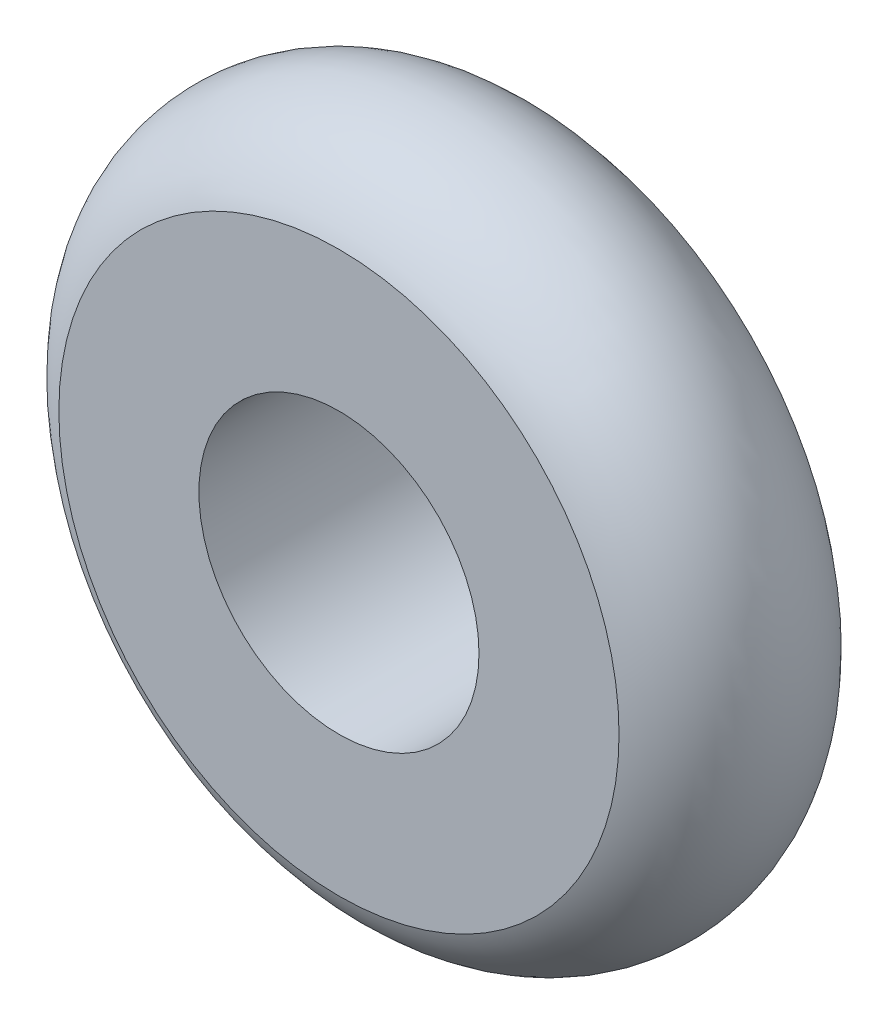
ISO-10303-21;
HEADER;
FILE_DESCRIPTION(('STEP AP214'),'2;1');
FILE_NAME('part.step','',(''),(''),'','','');
FILE_SCHEMA(('AUTOMOTIVE_DESIGN { 1 0 10303 214 1 1 1 1 }'));
ENDSEC;
DATA;
#1=APPLICATION_CONTEXT('core data for automotive mechanical design processes');
#2=APPLICATION_PROTOCOL_DEFINITION('international standard','automotive_design',2000,#1);
#3=PRODUCT_CONTEXT('',#1,'mechanical');
#4=PRODUCT('Part','Part','',(#3));
#5=PRODUCT_RELATED_PRODUCT_CATEGORY('part','',(#4));
#6=PRODUCT_DEFINITION_FORMATION('','',#4);
#7=PRODUCT_DEFINITION_CONTEXT('part definition',#1,'design');
#8=PRODUCT_DEFINITION('design','',#6,#7);
#9=PRODUCT_DEFINITION_SHAPE('','',#8);
#10=(LENGTH_UNIT() NAMED_UNIT(*) SI_UNIT(.MILLI.,.METRE.));
#11=(NAMED_UNIT(*) PLANE_ANGLE_UNIT() SI_UNIT($,.RADIAN.));
#12=(NAMED_UNIT(*) SI_UNIT($,.STERADIAN.) SOLID_ANGLE_UNIT());
#13=UNCERTAINTY_MEASURE_WITH_UNIT(LENGTH_MEASURE(1.E-05),#10,'distance_accuracy_value','');
#14=(GEOMETRIC_REPRESENTATION_CONTEXT(3) GLOBAL_UNCERTAINTY_ASSIGNED_CONTEXT((#13)) GLOBAL_UNIT_ASSIGNED_CONTEXT((#10,
#11,#12)) REPRESENTATION_CONTEXT('',''));
#15=CARTESIAN_POINT('',(0.,0.,0.));
#16=DIRECTION('',(0.,0.,1.));
#17=DIRECTION('',(1.,0.,0.));
#18=AXIS2_PLACEMENT_3D('',#15,#16,#17);
#19=CARTESIAN_POINT('',(0.,0.,0.));
#20=DIRECTION('',(0.,0.,1.));
#21=DIRECTION('',(1.,0.,0.));
#22=AXIS2_PLACEMENT_3D('',#19,#20,#21);
#23=CYLINDRICAL_SURFACE('',#22,4.);
#24=CARTESIAN_POINT('',(0.,0.,3.));
#25=DIRECTION('',(0.,0.,1.));
#26=DIRECTION('',(1.,0.,0.));
#27=AXIS2_PLACEMENT_3D('',#24,#25,#26);
#28=CIRCLE('',#27,4.);
#29=CARTESIAN_POINT('',(4.,0.,3.));
#30=VERTEX_POINT('',#29);
#31=EDGE_CURVE('E10',#30,#30,#28,.T.);
#32=ORIENTED_EDGE('',*,*,#31,.T.);
#33=EDGE_LOOP('',(#32));
#34=FACE_BOUND('',#33,.T.);
#35=CARTESIAN_POINT('',(0.,0.,-3.));
#36=DIRECTION('',(0.,0.,1.));
#37=DIRECTION('',(1.,0.,0.));
#38=AXIS2_PLACEMENT_3D('',#35,#36,#37);
#39=CIRCLE('',#38,4.);
#40=CARTESIAN_POINT('',(4.,0.,-3.));
#41=VERTEX_POINT('',#40);
#42=EDGE_CURVE('E48',#41,#41,#39,.T.);
#43=ORIENTED_EDGE('',*,*,#42,.F.);
#44=EDGE_LOOP('',(#43));
#45=FACE_BOUND('',#44,.T.);
#46=ADVANCED_FACE('F34',(#34,#45),#23,.F.);
#47=CARTESIAN_POINT('',(4.,0.,3.));
#48=DIRECTION('',(0.,0.,1.));
#49=DIRECTION('',(1.,0.,0.));
#50=AXIS2_PLACEMENT_3D('',#47,#48,#49);
#51=PLANE('',#50);
#52=CARTESIAN_POINT('',(0.,0.,3.));
#53=DIRECTION('',(0.,0.,1.));
#54=DIRECTION('',(1.,0.,0.));
#55=AXIS2_PLACEMENT_3D('',#52,#53,#54);
#56=CIRCLE('',#55,8.);
#57=CARTESIAN_POINT('',(8.,0.,3.));
#58=VERTEX_POINT('',#57);
#59=EDGE_CURVE('E40',#58,#58,#56,.T.);
#60=ORIENTED_EDGE('',*,*,#59,.T.);
#61=EDGE_LOOP('',(#60));
#62=FACE_BOUND('',#61,.T.);
#63=ORIENTED_EDGE('',*,*,#31,.F.);
#64=EDGE_LOOP('',(#63));
#65=FACE_BOUND('',#64,.T.);
#66=ADVANCED_FACE('F58',(#62,#65),#51,.T.);
#67=CARTESIAN_POINT('',(0.,0.,0.));
#68=DIRECTION('',(0.,0.,1.));
#69=DIRECTION('',(1.,0.,0.));
#70=AXIS2_PLACEMENT_3D('',#67,#68,#69);
#71=TOROIDAL_SURFACE('',#70,6.75,3.25);
#72=CARTESIAN_POINT('',(0.,0.,-3.));
#73=DIRECTION('',(0.,0.,1.));
#74=DIRECTION('',(1.,0.,0.));
#75=AXIS2_PLACEMENT_3D('',#72,#73,#74);
#76=CIRCLE('',#75,8.);
#77=CARTESIAN_POINT('',(8.,0.,-3.));
#78=VERTEX_POINT('',#77);
#79=EDGE_CURVE('E44',#78,#78,#76,.T.);
#80=ORIENTED_EDGE('',*,*,#79,.T.);
#81=EDGE_LOOP('',(#80));
#82=FACE_BOUND('',#81,.T.);
#83=ORIENTED_EDGE('',*,*,#59,.F.);
#84=EDGE_LOOP('',(#83));
#85=FACE_BOUND('',#84,.T.);
#86=ADVANCED_FACE('F62',(#82,#85),#71,.T.);
#87=CARTESIAN_POINT('',(4.,0.,-3.));
#88=DIRECTION('',(0.,0.,-1.));
#89=DIRECTION('',(-1.,0.,0.));
#90=AXIS2_PLACEMENT_3D('',#87,#88,#89);
#91=PLANE('',#90);
#92=ORIENTED_EDGE('',*,*,#42,.T.);
#93=EDGE_LOOP('',(#92));
#94=FACE_BOUND('',#93,.T.);
#95=ORIENTED_EDGE('',*,*,#79,.F.);
#96=EDGE_LOOP('',(#95));
#97=FACE_BOUND('',#96,.T.);
#98=ADVANCED_FACE('F54',(#94,#97),#91,.T.);
#99=CLOSED_SHELL('',(#46,#66,#86,#98));
#100=MANIFOLD_SOLID_BREP('B2',#99);
#101=ADVANCED_BREP_SHAPE_REPRESENTATION('',(#18,#100),#14);
#102=SHAPE_DEFINITION_REPRESENTATION(#9,#101);
ENDSEC;
END-ISO-10303-21;
